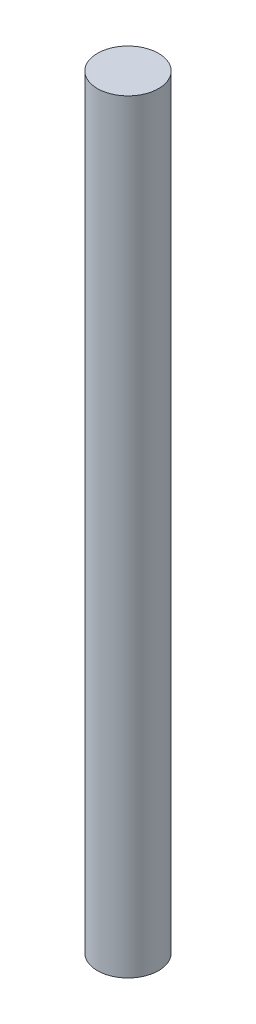
ISO-10303-21;
HEADER;
FILE_DESCRIPTION(('STEP AP214'),'2;1');
FILE_NAME('part.step','',(''),(''),'','','');
FILE_SCHEMA(('AUTOMOTIVE_DESIGN { 1 0 10303 214 1 1 1 1 }'));
ENDSEC;
DATA;
#1=APPLICATION_CONTEXT('core data for automotive mechanical design processes');
#2=APPLICATION_PROTOCOL_DEFINITION('international standard','automotive_design',2000,#1);
#3=PRODUCT_CONTEXT('',#1,'mechanical');
#4=PRODUCT('Part','Part','',(#3));
#5=PRODUCT_RELATED_PRODUCT_CATEGORY('part','',(#4));
#6=PRODUCT_DEFINITION_FORMATION('','',#4);
#7=PRODUCT_DEFINITION_CONTEXT('part definition',#1,'design');
#8=PRODUCT_DEFINITION('design','',#6,#7);
#9=PRODUCT_DEFINITION_SHAPE('','',#8);
#10=(LENGTH_UNIT() NAMED_UNIT(*) SI_UNIT(.MILLI.,.METRE.));
#11=(NAMED_UNIT(*) PLANE_ANGLE_UNIT() SI_UNIT($,.RADIAN.));
#12=(NAMED_UNIT(*) SI_UNIT($,.STERADIAN.) SOLID_ANGLE_UNIT());
#13=UNCERTAINTY_MEASURE_WITH_UNIT(LENGTH_MEASURE(1.E-05),#10,'distance_accuracy_value','');
#14=(GEOMETRIC_REPRESENTATION_CONTEXT(3) GLOBAL_UNCERTAINTY_ASSIGNED_CONTEXT((#13)) GLOBAL_UNIT_ASSIGNED_CONTEXT((#10,
#11,#12)) REPRESENTATION_CONTEXT('',''));
#15=CARTESIAN_POINT('',(0.,0.,0.));
#16=DIRECTION('',(0.,0.,1.));
#17=DIRECTION('',(1.,0.,0.));
#18=AXIS2_PLACEMENT_3D('',#15,#16,#17);
#19=CARTESIAN_POINT('',(0.,100.,0.));
#20=DIRECTION('',(0.,-1.,0.));
#21=DIRECTION('',(0.,0.,-1.));
#22=AXIS2_PLACEMENT_3D('',#19,#20,#21);
#23=CYLINDRICAL_SURFACE('',#22,4.);
#24=CARTESIAN_POINT('',(0.,100.,0.));
#25=DIRECTION('',(0.,1.,0.));
#26=DIRECTION('',(0.,0.,1.));
#27=AXIS2_PLACEMENT_3D('',#24,#25,#26);
#28=CIRCLE('',#27,4.);
#29=CARTESIAN_POINT('',(0.,100.,4.));
#30=VERTEX_POINT('',#29);
#31=EDGE_CURVE('E10',#30,#30,#28,.T.);
#32=ORIENTED_EDGE('',*,*,#31,.F.);
#33=EDGE_LOOP('',(#32));
#34=FACE_BOUND('',#33,.T.);
#35=CARTESIAN_POINT('',(0.,0.,0.));
#36=DIRECTION('',(0.,1.,0.));
#37=DIRECTION('',(0.,0.,1.));
#38=AXIS2_PLACEMENT_3D('',#35,#36,#37);
#39=CIRCLE('',#38,4.);
#40=CARTESIAN_POINT('',(0.,0.,4.));
#41=VERTEX_POINT('',#40);
#42=EDGE_CURVE('E36',#41,#41,#39,.T.);
#43=ORIENTED_EDGE('',*,*,#42,.T.);
#44=EDGE_LOOP('',(#43));
#45=FACE_BOUND('',#44,.T.);
#46=ADVANCED_FACE('F33',(#34,#45),#23,.T.);
#47=CARTESIAN_POINT('',(0.,100.,0.));
#48=DIRECTION('',(0.,1.,0.));
#49=DIRECTION('',(0.,0.,1.));
#50=AXIS2_PLACEMENT_3D('',#47,#48,#49);
#51=PLANE('',#50);
#52=ORIENTED_EDGE('',*,*,#31,.T.);
#53=EDGE_LOOP('',(#52));
#54=FACE_BOUND('',#53,.T.);
#55=ADVANCED_FACE('F48',(#54),#51,.T.);
#56=CARTESIAN_POINT('',(0.,0.,0.));
#57=DIRECTION('',(0.,1.,0.));
#58=DIRECTION('',(0.,0.,1.));
#59=AXIS2_PLACEMENT_3D('',#56,#57,#58);
#60=PLANE('',#59);
#61=ORIENTED_EDGE('',*,*,#42,.F.);
#62=EDGE_LOOP('',(#61));
#63=FACE_BOUND('',#62,.T.);
#64=ADVANCED_FACE('F46',(#63),#60,.F.);
#65=CLOSED_SHELL('',(#46,#55,#64));
#66=MANIFOLD_SOLID_BREP('B2',#65);
#67=ADVANCED_BREP_SHAPE_REPRESENTATION('',(#18,#66),#14);
#68=SHAPE_DEFINITION_REPRESENTATION(#9,#67);
ENDSEC;
END-ISO-10303-21;
